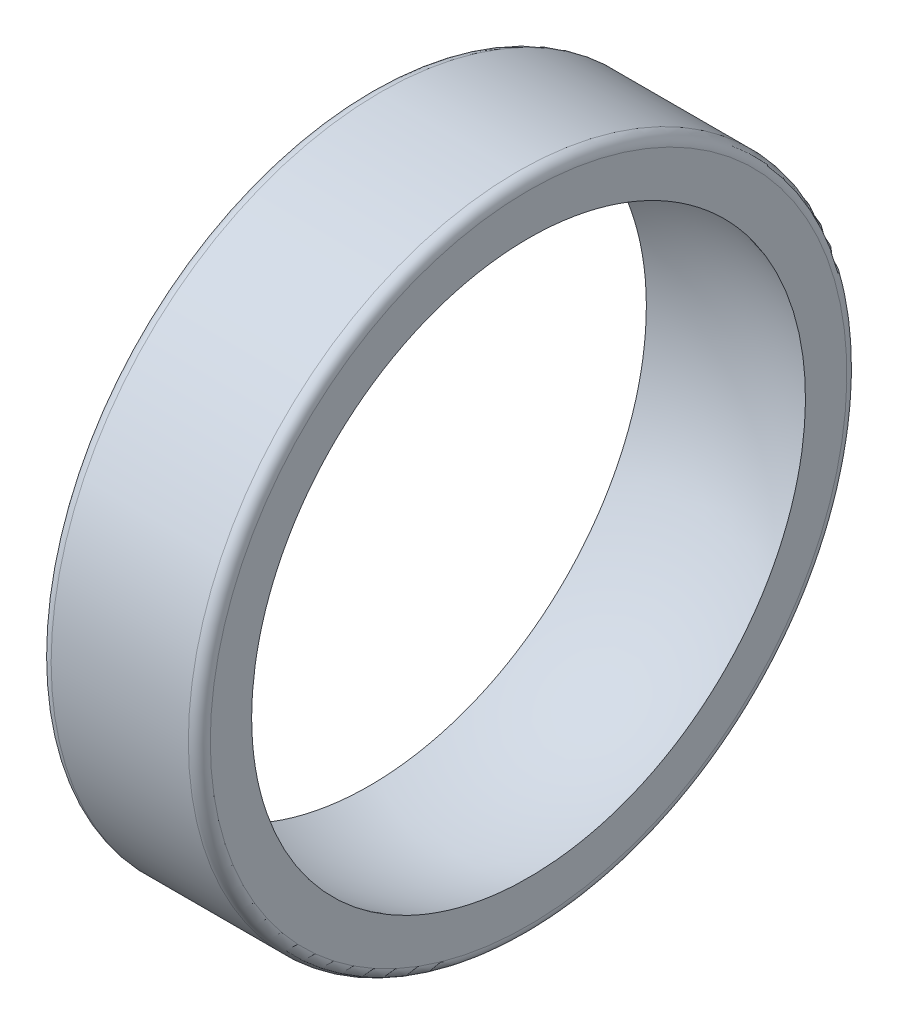
ISO-10303-21;
HEADER;
FILE_DESCRIPTION(('STEP AP214'),'2;1');
FILE_NAME('part.step','',(''),(''),'','','');
FILE_SCHEMA(('AUTOMOTIVE_DESIGN { 1 0 10303 214 1 1 1 1 }'));
ENDSEC;
DATA;
#1=APPLICATION_CONTEXT('core data for automotive mechanical design processes');
#2=APPLICATION_PROTOCOL_DEFINITION('international standard','automotive_design',2000,#1);
#3=PRODUCT_CONTEXT('',#1,'mechanical');
#4=PRODUCT('Part','Part','',(#3));
#5=PRODUCT_RELATED_PRODUCT_CATEGORY('part','',(#4));
#6=PRODUCT_DEFINITION_FORMATION('','',#4);
#7=PRODUCT_DEFINITION_CONTEXT('part definition',#1,'design');
#8=PRODUCT_DEFINITION('design','',#6,#7);
#9=PRODUCT_DEFINITION_SHAPE('','',#8);
#10=(LENGTH_UNIT() NAMED_UNIT(*) SI_UNIT(.MILLI.,.METRE.));
#11=(NAMED_UNIT(*) PLANE_ANGLE_UNIT() SI_UNIT($,.RADIAN.));
#12=(NAMED_UNIT(*) SI_UNIT($,.STERADIAN.) SOLID_ANGLE_UNIT());
#13=UNCERTAINTY_MEASURE_WITH_UNIT(LENGTH_MEASURE(1.E-05),#10,'distance_accuracy_value','');
#14=(GEOMETRIC_REPRESENTATION_CONTEXT(3) GLOBAL_UNCERTAINTY_ASSIGNED_CONTEXT((#13)) GLOBAL_UNIT_ASSIGNED_CONTEXT((#10,
#11,#12)) REPRESENTATION_CONTEXT('',''));
#15=CARTESIAN_POINT('',(0.,0.,0.));
#16=DIRECTION('',(0.,0.,1.));
#17=DIRECTION('',(1.,0.,0.));
#18=AXIS2_PLACEMENT_3D('',#15,#16,#17);
#19=CARTESIAN_POINT('',(20.75,0.,0.));
#20=DIRECTION('',(1.,0.,0.));
#21=DIRECTION('',(0.,0.,-1.));
#22=AXIS2_PLACEMENT_3D('',#19,#20,#21);
#23=CYLINDRICAL_SURFACE('',#22,60.);
#24=CARTESIAN_POINT('',(27.,0.,0.));
#25=DIRECTION('',(1.,0.,0.));
#26=DIRECTION('',(0.,1.,0.));
#27=AXIS2_PLACEMENT_3D('',#24,#25,#26);
#28=CIRCLE('',#27,60.);
#29=CARTESIAN_POINT('',(27.,60.,0.));
#30=VERTEX_POINT('',#29);
#31=EDGE_CURVE('E79',#30,#30,#28,.T.);
#32=ORIENTED_EDGE('',*,*,#31,.F.);
#33=EDGE_LOOP('',(#32));
#34=FACE_BOUND('',#33,.T.);
#35=CARTESIAN_POINT('',(1.99999999999999,0.,0.));
#36=DIRECTION('',(1.,0.,0.));
#37=DIRECTION('',(0.,1.,0.));
#38=AXIS2_PLACEMENT_3D('',#35,#36,#37);
#39=CIRCLE('',#38,60.);
#40=CARTESIAN_POINT('',(1.99999999999999,60.,0.));
#41=VERTEX_POINT('',#40);
#42=EDGE_CURVE('E99',#41,#41,#39,.F.);
#43=ORIENTED_EDGE('',*,*,#42,.F.);
#44=EDGE_LOOP('',(#43));
#45=FACE_BOUND('',#44,.T.);
#46=ADVANCED_FACE('F14',(#34,#45),#23,.T.);
#47=CARTESIAN_POINT('',(1.99999999999999,0.,0.));
#48=DIRECTION('',(1.,0.,0.));
#49=DIRECTION('',(0.,1.,0.));
#50=AXIS2_PLACEMENT_3D('',#47,#48,#49);
#51=TOROIDAL_SURFACE('',#50,58.,1.99999999999999);
#52=CARTESIAN_POINT('',(0.,0.,0.));
#53=DIRECTION('',(1.,0.,0.));
#54=DIRECTION('',(0.,0.,1.));
#55=AXIS2_PLACEMENT_3D('',#52,#53,#54);
#56=CIRCLE('',#55,58.);
#57=CARTESIAN_POINT('',(0.,0.,58.));
#58=VERTEX_POINT('',#57);
#59=EDGE_CURVE('E68',#58,#58,#56,.F.);
#60=ORIENTED_EDGE('',*,*,#59,.F.);
#61=EDGE_LOOP('',(#60));
#62=FACE_BOUND('',#61,.T.);
#63=ORIENTED_EDGE('',*,*,#42,.T.);
#64=EDGE_LOOP('',(#63));
#65=FACE_BOUND('',#64,.T.);
#66=ADVANCED_FACE('F84',(#62,#65),#51,.T.);
#67=CARTESIAN_POINT('',(27.,0.,0.));
#68=DIRECTION('',(1.,0.,0.));
#69=DIRECTION('',(0.,1.,0.));
#70=AXIS2_PLACEMENT_3D('',#67,#68,#69);
#71=TOROIDAL_SURFACE('',#70,58.,2.);
#72=ORIENTED_EDGE('',*,*,#31,.T.);
#73=EDGE_LOOP('',(#72));
#74=FACE_BOUND('',#73,.T.);
#75=CARTESIAN_POINT('',(29.,0.,0.));
#76=DIRECTION('',(-1.,0.,0.));
#77=DIRECTION('',(0.,0.,1.));
#78=AXIS2_PLACEMENT_3D('',#75,#76,#77);
#79=CIRCLE('',#78,58.);
#80=CARTESIAN_POINT('',(29.,0.,58.));
#81=VERTEX_POINT('',#80);
#82=EDGE_CURVE('E31',#81,#81,#79,.F.);
#83=ORIENTED_EDGE('',*,*,#82,.F.);
#84=EDGE_LOOP('',(#83));
#85=FACE_BOUND('',#84,.T.);
#86=ADVANCED_FACE('F81',(#74,#85),#71,.T.);
#87=CARTESIAN_POINT('',(0.,0.,54.2289516230857));
#88=DIRECTION('',(-1.,0.,0.));
#89=DIRECTION('',(0.,0.,1.));
#90=AXIS2_PLACEMENT_3D('',#87,#88,#89);
#91=PLANE('',#90);
#92=CARTESIAN_POINT('',(0.,50.4579032482839,0.));
#93=CARTESIAN_POINT('',(0.,50.4578942165374,-1.41747901961057));
#94=CARTESIAN_POINT('',(0.,50.3981229332466,-2.83520642923819));
#95=CARTESIAN_POINT('',(0.,50.1594119916498,-5.66080269766641));
#96=CARTESIAN_POINT('',(0.,49.9804437000898,-7.06866910554365));
#97=CARTESIAN_POINT('',(0.,49.5043497563438,-9.86578906018729));
#98=CARTESIAN_POINT('',(0.,49.2071042154521,-11.2550222383471));
#99=CARTESIAN_POINT('',(0.,48.4965922410418,-14.0033961521178));
#100=CARTESIAN_POINT('',(0.,48.0833328383131,-15.3625387059278));
#101=CARTESIAN_POINT('',(0.,47.1439232301512,-18.0406004114623));
#102=CARTESIAN_POINT('',(0.,46.6178200500792,-19.3595360579004));
#103=CARTESIAN_POINT('',(0.,45.4563538052293,-21.9484112370284));
#104=CARTESIAN_POINT('',(0.,44.8209891684876,-23.2183500644705));
#105=CARTESIAN_POINT('',(0.,43.4456835508566,-25.6998928313902));
#106=CARTESIAN_POINT('',(0.,42.7057669085628,-26.9115102597126));
#107=CARTESIAN_POINT('',(0.,41.126507961166,-29.2681096306182));
#108=CARTESIAN_POINT('',(0.,40.2871660100119,-30.4130918103977));
#109=CARTESIAN_POINT('',(0.,38.514934268562,-32.6283944709161));
#110=CARTESIAN_POINT('',(0.,37.582035423737,-33.6987077080903));
#111=CARTESIAN_POINT('',(0.,35.6293889290824,-35.7569424946668));
#112=CARTESIAN_POINT('',(0.,34.6096411992878,-36.7448639682064));
#113=CARTESIAN_POINT('',(0.,32.490509464534,-38.6313244585617));
#114=CARTESIAN_POINT('',(0.,31.3911226289657,-39.5298602956512));
#115=CARTESIAN_POINT('',(0.,29.1205612072635,-41.2311211258273));
#116=CARTESIAN_POINT('',(0.,27.9493866338154,-42.0338461358446));
#117=CARTESIAN_POINT('',(0.,25.543595944996,-43.5377660709861));
#118=CARTESIAN_POINT('',(0.,24.308980870128,-44.238962660583));
#119=CARTESIAN_POINT('',(0.,21.7850688941319,-45.5348563357488));
#120=CARTESIAN_POINT('',(0.,20.4957719921287,-46.1295534196131));
#121=CARTESIAN_POINT('',(0.,17.8716664638193,-47.2082185014144));
#122=CARTESIAN_POINT('',(0.,16.5368579733944,-47.6921868299147));
#123=CARTESIAN_POINT('',(0.,13.8312152807833,-48.5459559601719));
#124=CARTESIAN_POINT('',(0.,12.4603810786757,-48.915756762178));
#125=CARTESIAN_POINT('',(0.,9.69243047261454,-49.5385622960823));
#126=CARTESIAN_POINT('',(0.,8.29531402561589,-49.7915668366744));
#127=CARTESIAN_POINT('',(0.,5.4847337743968,-50.1789802433809));
#128=CARTESIAN_POINT('',(0.,4.07126997015219,-50.3133891093199));
#129=CARTESIAN_POINT('',(0.,1.23804430860456,-50.46265557761));
#130=CARTESIAN_POINT('',(0.,-0.181717546840363,-50.4775132152299));
#131=CARTESIAN_POINT('',(0.,-3.01744606725697,-50.3875716904323));
#132=CARTESIAN_POINT('',(0.,-4.43341273224713,-50.2827725285971));
#133=CARTESIAN_POINT('',(0.,-7.2514771381293,-49.9542632893576));
#134=CARTESIAN_POINT('',(0.,-8.65357494848953,-49.730553807875));
#135=CARTESIAN_POINT('',(0.,-11.4339408874757,-49.1658147219959));
#136=CARTESIAN_POINT('',(0.,-12.812209015914,-48.8247851166751));
#137=CARTESIAN_POINT('',(0.,-15.5351311022455,-48.0278261495076));
#138=CARTESIAN_POINT('',(0.,-16.8797847127707,-47.5718956008283));
#139=CARTESIAN_POINT('',(0.,-19.525903148654,-46.5483779442095));
#140=CARTESIAN_POINT('',(0.,-20.8273679754677,-45.9807908400328));
#141=CARTESIAN_POINT('',(0.,-23.3779043225308,-44.7379718384527));
#142=CARTESIAN_POINT('',(0.,-24.6269738644712,-44.0627358811224));
#143=CARTESIAN_POINT('',(0.,-27.0637871218787,-42.6094351399624));
#144=CARTESIAN_POINT('',(0.,-28.2515308136152,-41.8313703163425));
#145=CARTESIAN_POINT('',(0.,-30.557148511794,-40.1780147372503));
#146=CARTESIAN_POINT('',(0.,-31.6750284700528,-39.3027322816141));
#147=CARTESIAN_POINT('',(0.,-33.8330801921333,-37.461111423347));
#148=CARTESIAN_POINT('',(0.,-34.873252111183,-36.4947732026161));
#149=CARTESIAN_POINT('',(0.,-36.8682992865836,-34.4781075616025));
#150=CARTESIAN_POINT('',(0.,-37.8231912910662,-33.427796709843));
#151=CARTESIAN_POINT('',(0.,-39.6411301341785,-31.2504755845058));
#152=CARTESIAN_POINT('',(0.,-40.504176274235,-30.12346472766));
#153=CARTESIAN_POINT('',(0.,-42.1326778833888,-27.8001948274753));
#154=CARTESIAN_POINT('',(0.,-42.8980857588683,-26.6039024229225));
#155=CARTESIAN_POINT('',(0.,-44.3253537417507,-24.1511131178391));
#156=CARTESIAN_POINT('',(0.,-44.9872169846497,-22.8946180418469));
#157=CARTESIAN_POINT('',(0.,-46.203194930489,-20.3293195031164));
#158=CARTESIAN_POINT('',(0.,-46.757224399658,-19.020475640007));
#159=CARTESIAN_POINT('',(0.,-47.7530017955737,-16.3605524031181));
#160=CARTESIAN_POINT('',(0.,-48.1947355966583,-15.0094677398529));
#161=CARTESIAN_POINT('',(0.,-48.9619280195503,-12.277575386994));
#162=CARTESIAN_POINT('',(0.,-49.2876127354516,-10.8968311117518));
#163=CARTESIAN_POINT('',(0.,-49.8214786118022,-8.11337704658598));
#164=CARTESIAN_POINT('',(0.,-50.0297175937849,-6.710678415564));
#165=CARTESIAN_POINT('',(0.,-50.2716088963852,-4.42150390742653));
#166=CARTESIAN_POINT('',(0.,-50.3414474450798,-3.53869424586048));
#167=CARTESIAN_POINT('',(0.,-50.4345970777203,-1.77062314824071));
#168=CARTESIAN_POINT('',(0.,-50.457908135101,-0.885361710787427));
#169=CARTESIAN_POINT('',(0.,-50.457895429495,1.41655725989264));
#170=CARTESIAN_POINT('',(0.,-50.3982006034824,2.83337121173692));
#171=CARTESIAN_POINT('',(0.,-50.1597672620518,5.65751217315442));
#172=CARTESIAN_POINT('',(0.,-49.9809700725716,7.06483416130696));
#173=CARTESIAN_POINT('',(0.,-49.505083905605,9.86221730954923));
#174=CARTESIAN_POINT('',(0.,-49.207763323338,11.2522391468487));
#175=CARTESIAN_POINT('',(0.,-48.4969949197943,14.0020717230469));
#176=CARTESIAN_POINT('',(0.,-48.0835617038684,15.3618862384065));
#177=CARTESIAN_POINT('',(0.,-47.1438608249611,18.0407783350363));
#178=CARTESIAN_POINT('',(0.,-46.6176802746208,19.3598864724007));
#179=CARTESIAN_POINT('',(0.,-45.4560213532722,21.9491133871796));
#180=CARTESIAN_POINT('',(0.,-44.8205396527926,23.2192306708186));
#181=CARTESIAN_POINT('',(0.,-43.4451678257915,25.700753841664));
#182=CARTESIAN_POINT('',(0.,-42.7053321109896,26.9121898866823));
#183=CARTESIAN_POINT('',(0.,-41.1262672493638,29.2684379982115));
#184=CARTESIAN_POINT('',(0.,-40.2870389499133,30.4132506325974));
#185=CARTESIAN_POINT('',(0.,-38.5150587146721,32.6282389162216));
#186=CARTESIAN_POINT('',(0.,-37.5822974499439,33.6984071023693));
#187=CARTESIAN_POINT('',(0.,-35.6299450630653,35.7563806884838));
#188=CARTESIAN_POINT('',(0.,-34.610353458498,36.7441856307919));
#189=CARTESIAN_POINT('',(0.,-32.4912555485116,38.6307045497296));
#190=CARTESIAN_POINT('',(0.,-31.3917240390519,39.5293902152095));
#191=CARTESIAN_POINT('',(0.,-29.1208674157233,41.2309111480567));
#192=CARTESIAN_POINT('',(0.,-27.9495433629408,42.0337478315453));
#193=CARTESIAN_POINT('',(0.,-25.5429645839058,43.538161079723));
#194=CARTESIAN_POINT('',(0.,-24.3076858512723,44.2396992405294));
#195=CARTESIAN_POINT('',(0.,-21.7823074348564,45.5362024243109));
#196=CARTESIAN_POINT('',(0.,-20.4922044318999,46.1311609833328));
#197=CARTESIAN_POINT('',(0.,-17.8678206947252,47.2096579264686));
#198=CARTESIAN_POINT('',(0.,-16.5335865469565,47.6933097708183));
#199=CARTESIAN_POINT('',(0.,-13.8293235964871,48.5464620954812));
#200=CARTESIAN_POINT('',(0.,-12.4593034705564,48.9159899730315));
#201=CARTESIAN_POINT('',(0.,-10.1684773217205,49.4314549698082));
#202=CARTESIAN_POINT('',(0.,-9.25499738138924,49.6105953578021));
#203=CARTESIAN_POINT('',(0.,-7.41938975135202,49.9181181602853));
#204=CARTESIAN_POINT('',(0.,-6.49726124483452,50.0464957300545));
#205=CARTESIAN_POINT('',(0.,-4.64731470530067,50.2520507586378));
#206=CARTESIAN_POINT('',(0.,-3.71949666939763,50.3292281914724));
#207=CARTESIAN_POINT('',(0.,-1.86115460015058,50.4321549482291));
#208=CARTESIAN_POINT('',(0.,-0.930630833418868,50.4579091779741));
#209=CARTESIAN_POINT('',(0.,1.4174778632289,50.4578942165557));
#210=CARTESIAN_POINT('',(0.,2.83520411528718,50.3981230308188));
#211=CARTESIAN_POINT('',(0.,5.66079809432789,50.1594124785125));
#212=CARTESIAN_POINT('',(0.,7.0686633703809,49.9804444785966));
#213=CARTESIAN_POINT('',(0.,9.86578340398853,49.5043509169213));
#214=CARTESIAN_POINT('',(0.,11.2550177601177,49.2071052731638));
#215=CARTESIAN_POINT('',(0.,14.0033939591524,48.4965929079711));
#216=CARTESIAN_POINT('',(0.,15.3625376207724,48.083333219319));
#217=CARTESIAN_POINT('',(0.,18.040623728198,47.1439150507589));
#218=CARTESIAN_POINT('',(0.,19.3595820105579,46.6178017198665));
#219=CARTESIAN_POINT('',(0.,21.9485008290664,45.456311324859));
#220=CARTESIAN_POINT('',(0.,23.218460651228,44.8209326693067));
#221=CARTESIAN_POINT('',(0.,25.7000000333564,43.4456193492684));
#222=CARTESIAN_POINT('',(0.,26.9115950922672,42.7057126500735));
#223=CARTESIAN_POINT('',(0.,29.2681507988347,41.1264777809726));
#224=CARTESIAN_POINT('',(0.,30.413111744963,40.2871500564503));
#225=CARTESIAN_POINT('',(0.,32.628267419742,38.5150359149084));
#226=CARTESIAN_POINT('',(0.,33.6984621361451,37.5822494825793));
#227=CARTESIAN_POINT('',(0.,35.7564832850468,35.6298434897925));
#228=CARTESIAN_POINT('',(0.,36.7443093485327,34.610223540361));
#229=CARTESIAN_POINT('',(0.,38.6308186711735,32.4911183017334));
#230=CARTESIAN_POINT('',(0.,39.5294780787233,31.3916117788221));
#231=CARTESIAN_POINT('',(0.,41.2309513815751,29.1208087168605));
#232=CARTESIAN_POINT('',(0.,42.0337666728365,27.949513223785));
#233=CARTESIAN_POINT('',(0.,43.5381580490634,25.5429694311205));
#234=CARTESIAN_POINT('',(0.,44.2396935955702,24.3076957908087));
#235=CARTESIAN_POINT('',(0.,45.5361924115594,21.782327994012));
#236=CARTESIAN_POINT('',(0.,46.1311492189774,20.4922305193212));
#237=CARTESIAN_POINT('',(0.,47.2096479407752,17.8678475309178));
#238=CARTESIAN_POINT('',(0.,47.6933024217075,16.5336082368149));
#239=CARTESIAN_POINT('',(0.,48.5464591112811,13.8293346595793));
#240=CARTESIAN_POINT('',(0.,48.9159887168032,12.4593090531136));
#241=CARTESIAN_POINT('',(0.,49.4314551414631,10.1684765590919));
#242=CARTESIAN_POINT('',(0.,49.6105956586062,9.25499584764356));
#243=CARTESIAN_POINT('',(0.,49.9181186337141,7.41938666373317));
#244=CARTESIAN_POINT('',(0.,50.0464962470093,6.49725737446832));
#245=CARTESIAN_POINT('',(0.,50.2520511038529,4.64731081633889));
#246=CARTESIAN_POINT('',(0.,50.3292284072696,3.7194935541265));
#247=CARTESIAN_POINT('',(0.,50.4321549914263,1.86115303915012));
#248=CARTESIAN_POINT('',(0.,50.4579091779763,0.930630052997476));
#249=CARTESIAN_POINT('',(0.,50.4579032482839,0.));
#250=B_SPLINE_CURVE_WITH_KNOTS('',3,(#92,#93,#94,#95,#96,#97,#98,#99,#100,#101,#102,#103,#104,
#105,#106,#107,#108,#109,#110,#111,#112,#113,#114,#115,#116,#117,#118,#119,#120,#121,#122,#123,
#124,#125,#126,#127,#128,#129,#130,#131,#132,#133,#134,#135,#136,#137,#138,#139,#140,#141,#142,
#143,#144,#145,#146,#147,#148,#149,#150,#151,#152,#153,#154,#155,#156,#157,#158,#159,#160,#161,
#162,#163,#164,#165,#166,#167,#168,#169,#170,#171,#172,#173,#174,#175,#176,#177,#178,#179,#180,
#181,#182,#183,#184,#185,#186,#187,#188,#189,#190,#191,#192,#193,#194,#195,#196,#197,#198,#199,
#200,#201,#202,#203,#204,#205,#206,#207,#208,#209,#210,#211,#212,#213,#214,#215,#216,#217,#218,
#219,#220,#221,#222,#223,#224,#225,#226,#227,#228,#229,#230,#231,#232,#233,#234,#235,#236,#237,
#238,#239,#240,#241,#242,#243,#244,#245,#246,#247,#248,#249),.UNSPECIFIED.,.T.,.F.,(4,2,2,2,2,2,
2,2,2,2,2,2,2,2,2,2,2,2,2,2,2,2,2,2,2,2,2,2,2,2,2,2,2,2,2,2,2,2,2,2,2,2,2,2,2,2,2,2,2,2,2,2,2,2,
2,2,2,2,2,2,2,2,2,2,2,2,2,2,2,2,2,2,2,2,2,2,2,2,4),(0.,4.25160972579004,8.50424113284684,
12.761194136492,17.0178892116191,21.272813829759,25.5277996693658,29.7817966203531,
34.0357784277866,38.290172337854,42.5445701651394,46.7991192805549,51.0536676441447,
55.3081462501053,59.5626249241622,63.8170908969794,68.0715568605075,72.3260297926036,
76.580502730995,80.8349744142822,85.0894460768705,89.3438964182806,93.598346793203,
97.8528411149073,102.107335293233,106.361989965817,110.616646284758,114.870939646425,
119.125224509568,123.378672027478,127.632151894504,131.887697254607,136.143113725078,
140.401880214861,144.661182149721,148.912139879643,153.161002923536,155.816579967996,
158.472158528676,162.721019805949,166.971975772979,171.231279510685,175.49004772712,
179.745537255297,184.001156434812,188.254564818608,192.507936942501,196.761733718659,
201.015554129843,205.270721582059,209.525826158495,213.782539701025,218.039511321913,
222.292124196482,226.543715370041,229.335063275128,232.126677517623,234.918293176615,
237.70964250006,241.961248757277,246.213876699889,250.47083320649,254.727531711665,
258.982530417963,263.237591103096,267.491515543381,271.745420927768,275.999327008993,
280.253252146746,284.508312136337,288.763310143871,293.020006572467,297.276961005076,
301.52959102212,305.781199355485,308.572549603061,311.364166185041,314.155779502799,
316.947126485504),.UNSPECIFIED.);
#251=CARTESIAN_POINT('',(0.,50.4579032482839,0.));
#252=VERTEX_POINT('',#251);
#253=EDGE_CURVE('E26',#252,#252,#250,.T.);
#254=ORIENTED_EDGE('',*,*,#253,.F.);
#255=EDGE_LOOP('',(#254));
#256=FACE_BOUND('',#255,.T.);
#257=ORIENTED_EDGE('',*,*,#59,.T.);
#258=EDGE_LOOP('',(#257));
#259=FACE_BOUND('',#258,.T.);
#260=ADVANCED_FACE('F48',(#256,#259),#91,.T.);
#261=CARTESIAN_POINT('',(28.9999999999862,0.,54.2289516230377));
#262=DIRECTION('',(1.,0.,-3.66148092848931E-12));
#263=DIRECTION('',(-3.66148092848931E-12,0.,-1.));
#264=AXIS2_PLACEMENT_3D('',#261,#262,#263);
#265=PLANE('',#264);
#266=ORIENTED_EDGE('',*,*,#82,.T.);
#267=EDGE_LOOP('',(#266));
#268=FACE_BOUND('',#267,.T.);
#269=CARTESIAN_POINT('',(28.9999999999724,0.,50.4579032481877));
#270=CARTESIAN_POINT('',(28.9999999999724,-1.41747786322766,50.4578942164596));
#271=CARTESIAN_POINT('',(28.9999999999722,-2.83520411528473,50.3981230307227));
#272=CARTESIAN_POINT('',(28.9999999999713,-5.66079809432301,50.1594124784166));
#273=CARTESIAN_POINT('',(28.9999999999706,-7.06866337037482,49.9804444785009));
#274=CARTESIAN_POINT('',(28.9999999999689,-9.86578340398007,49.504350916826));
#275=CARTESIAN_POINT('',(28.9999999999678,-11.2550177601081,49.2071052730687));
#276=CARTESIAN_POINT('',(28.9999999999652,-14.0033939591404,48.4965929078767));
#277=CARTESIAN_POINT('',(28.9999999999637,-15.3625376207592,48.0833332192249));
#278=CARTESIAN_POINT('',(28.9999999999602,-18.0406237281826,47.1439150506656));
#279=CARTESIAN_POINT('',(28.9999999999583,-19.3595820105414,46.6178017197736));
#280=CARTESIAN_POINT('',(28.9999999999541,-21.9485008290477,45.4563113247672));
#281=CARTESIAN_POINT('',(28.9999999999517,-23.2184606512081,44.8209326692154));
#282=CARTESIAN_POINT('',(28.9999999999467,-25.7000000333345,43.4456193491783));
#283=CARTESIAN_POINT('',(28.999999999944,-26.9115950922442,42.705712649984));
#284=CARTESIAN_POINT('',(28.9999999999382,-29.2681507988097,41.1264777808845));
#285=CARTESIAN_POINT('',(28.9999999999351,-30.413111744937,40.2871500563629));
#286=CARTESIAN_POINT('',(28.9999999999286,-32.6282674197141,38.5150359148225));
#287=CARTESIAN_POINT('',(28.9999999999252,-33.6984621361164,37.5822494824942));
#288=CARTESIAN_POINT('',(28.9999999999181,-35.7564832850163,35.6298434897091));
#289=CARTESIAN_POINT('',(28.9999999999144,-36.7443093485013,34.6102235402785));
#290=CARTESIAN_POINT('',(28.9999999999066,-38.6308186711405,32.4911183016527));
#291=CARTESIAN_POINT('',(28.9999999999026,-39.5294780786896,31.3916117787423));
#292=CARTESIAN_POINT('',(28.9999999998943,-41.23095138154,29.1208087167826));
#293=CARTESIAN_POINT('',(28.99999999989,-42.0337666728006,27.9495132237081));
#294=CARTESIAN_POINT('',(28.9999999998812,-43.5381580490263,25.5429694310457));
#295=CARTESIAN_POINT('',(28.9999999998766,-44.2396935955325,24.3076957907349));
#296=CARTESIAN_POINT('',(28.9999999998674,-45.5361924115205,21.7823279939404));
#297=CARTESIAN_POINT('',(28.9999999998627,-46.131149218938,20.4922305192506));
#298=CARTESIAN_POINT('',(28.999999999853,-47.2096479407349,17.8678475308494));
#299=CARTESIAN_POINT('',(28.9999999998482,-47.6933024216668,16.5336082367477));
#300=CARTESIAN_POINT('',(28.9999999998383,-48.5464591112397,13.8293346595144));
#301=CARTESIAN_POINT('',(28.9999999998332,-48.9159887167614,12.4593090530499));
#302=CARTESIAN_POINT('',(28.9999999998249,-49.43145514142,10.1684765590345));
#303=CARTESIAN_POINT('',(28.9999999998215,-49.6105956585622,9.25499584759128));
#304=CARTESIAN_POINT('',(28.9999999998148,-49.9181186336689,7.41938666369126));
#305=CARTESIAN_POINT('',(28.9999999998114,-50.0464962469637,6.49725737443163));
#306=CARTESIAN_POINT('',(28.9999999998046,-50.2520511038072,4.64731081631269));
#307=CARTESIAN_POINT('',(28.9999999998012,-50.3292284072239,3.71949355410556));
#308=CARTESIAN_POINT('',(28.9999999997944,-50.4321549913816,1.86115303913967));
#309=CARTESIAN_POINT('',(28.999999999791,-50.4579091779323,0.930630052992268));
#310=CARTESIAN_POINT('',(28.9999999997825,-50.4578942164959,-1.41747901960934));
#311=CARTESIAN_POINT('',(28.9999999997773,-50.3981229332066,-2.83520642923581));
#312=CARTESIAN_POINT('',(28.9999999997669,-50.159411991613,-5.66080269766185));
#313=CARTESIAN_POINT('',(28.9999999997617,-49.9804437000546,-7.06866910553808));
#314=CARTESIAN_POINT('',(28.9999999997515,-49.5043497563119,-9.86578906017984));
#315=CARTESIAN_POINT('',(28.9999999997464,-49.207104215422,-11.2550222383388));
#316=CARTESIAN_POINT('',(28.9999999997364,-48.4965922410152,-14.0033961521079));
#317=CARTESIAN_POINT('',(28.9999999997314,-48.0833328382882,-15.3625387059172));
#318=CARTESIAN_POINT('',(28.9999999997216,-47.1439232301299,-18.0406004114504));
#319=CARTESIAN_POINT('',(28.9999999997167,-46.6178200500598,-19.3595360578879));
#320=CARTESIAN_POINT('',(28.9999999997073,-45.4563538052136,-21.9484112370149));
#321=CARTESIAN_POINT('',(28.9999999997026,-44.8209891684738,-23.2183500644566));
#322=CARTESIAN_POINT('',(28.9999999996935,-43.4456835508466,-25.6998928313757));
#323=CARTESIAN_POINT('',(28.9999999996891,-42.7057669085547,-26.9115102596979));
#324=CARTESIAN_POINT('',(28.9999999996805,-41.1265079611617,-29.268109630603));
#325=CARTESIAN_POINT('',(28.9999999996763,-40.2871660100095,-30.4130918103824));
#326=CARTESIAN_POINT('',(28.9999999996682,-38.5149342685635,-32.6283944709009));
#327=CARTESIAN_POINT('',(28.9999999996642,-37.5820354237404,-33.6987077080751));
#328=CARTESIAN_POINT('',(28.9999999996567,-35.6293889290896,-35.7569424946519));
#329=CARTESIAN_POINT('',(28.9999999996531,-34.6096411992969,-36.7448639681918));
#330=CARTESIAN_POINT('',(28.9999999996462,-32.4905094645469,-38.6313244585476));
#331=CARTESIAN_POINT('',(28.9999999996429,-31.3911226289805,-39.5298602956376));
#332=CARTESIAN_POINT('',(28.9999999996367,-29.1205612072821,-41.2311211258146));
#333=CARTESIAN_POINT('',(28.9999999996337,-27.9493866338358,-42.0338461358324));
#334=CARTESIAN_POINT('',(28.9999999996282,-25.5435959450201,-43.5377660709752));
#335=CARTESIAN_POINT('',(28.9999999996256,-24.3089808701538,-44.2389626605728));
#336=CARTESIAN_POINT('',(28.9999999996209,-21.7850688941613,-45.5348563357401));
#337=CARTESIAN_POINT('',(28.9999999996187,-20.4957719921598,-46.1295534196053));
#338=CARTESIAN_POINT('',(28.9999999996148,-17.8716664638538,-47.2082185014085));
#339=CARTESIAN_POINT('',(28.999999999613,-16.5368579734305,-47.6921868299098));
#340=CARTESIAN_POINT('',(28.9999999996099,-13.8312152808226,-48.545955960169));
#341=CARTESIAN_POINT('',(28.9999999996085,-12.4603810787166,-48.9157567621762));
#342=CARTESIAN_POINT('',(28.9999999996063,-9.6924304726584,-49.538562296083));
#343=CARTESIAN_POINT('',(28.9999999996053,-8.29531402566119,-49.7915668366763));
#344=CARTESIAN_POINT('',(28.9999999996039,-5.48473377444491,-50.1789802433855));
#345=CARTESIAN_POINT('',(28.9999999996034,-4.07126997020165,-50.3133891093258));
#346=CARTESIAN_POINT('',(28.9999999996029,-1.23804430865659,-50.4626555776188));
#347=CARTESIAN_POINT('',(28.9999999996028,0.181717546787107,-50.4775132152401));
#348=CARTESIAN_POINT('',(28.9999999996031,3.01744606720139,-50.3875716904456));
#349=CARTESIAN_POINT('',(28.9999999996035,4.43341273219045,-50.2827725286119));
#350=CARTESIAN_POINT('',(28.9999999996047,7.25147713807057,-49.9542632893757));
#351=CARTESIAN_POINT('',(28.9999999996055,8.65357494842983,-49.7305538078948));
#352=CARTESIAN_POINT('',(28.9999999996076,11.4339408874142,-49.1658147220191));
#353=CARTESIAN_POINT('',(28.9999999996089,12.8122090158517,-48.8247851167));
#354=CARTESIAN_POINT('',(28.9999999996118,15.5351311021817,-48.027826149536));
#355=CARTESIAN_POINT('',(28.9999999996134,16.8797847127062,-47.5718956008586));
#356=CARTESIAN_POINT('',(28.9999999996172,19.5259031485884,-46.5483779442434));
#357=CARTESIAN_POINT('',(28.9999999996193,20.8273679754015,-45.9807908400686));
#358=CARTESIAN_POINT('',(28.9999999996238,23.3779043224638,-44.7379718384922));
#359=CARTESIAN_POINT('',(28.9999999996263,24.6269738644039,-44.0627358811639));
#360=CARTESIAN_POINT('',(28.9999999996316,27.0637871218107,-42.6094351400076));
#361=CARTESIAN_POINT('',(28.9999999996345,28.2515308135471,-41.8313703163897));
#362=CARTESIAN_POINT('',(28.9999999996405,30.5571485117256,-40.1780147373013));
#363=CARTESIAN_POINT('',(28.9999999996437,31.6750284699845,-39.302732281667));
#364=CARTESIAN_POINT('',(28.9999999996505,33.833080192065,-37.4611114234038));
#365=CARTESIAN_POINT('',(28.999999999654,34.8732521111149,-36.4947732026748));
#366=CARTESIAN_POINT('',(28.9999999996614,36.8682992865158,-34.478107561665));
#367=CARTESIAN_POINT('',(28.9999999996652,37.8231912909987,-33.4277967099074));
#368=CARTESIAN_POINT('',(28.9999999996732,39.6411301341118,-31.250475584574));
#369=CARTESIAN_POINT('',(28.9999999996773,40.5041762741688,-30.12346472773));
#370=CARTESIAN_POINT('',(28.9999999996858,42.1326778833236,-27.8001948275491));
#371=CARTESIAN_POINT('',(28.9999999996902,42.8980857588037,-26.603902422998));
#372=CARTESIAN_POINT('',(28.9999999996992,44.3253537416875,-24.1511131179183));
#373=CARTESIAN_POINT('',(28.9999999997038,44.9872169845873,-22.8946180419279));
#374=CARTESIAN_POINT('',(28.9999999997132,46.2031949304282,-20.3293195032009));
#375=CARTESIAN_POINT('',(28.999999999718,46.7572243995981,-19.0204756400932));
#376=CARTESIAN_POINT('',(28.9999999997277,47.7530017955157,-16.3605524032076));
#377=CARTESIAN_POINT('',(28.9999999997327,48.1947355966014,-15.009467739944));
#378=CARTESIAN_POINT('',(28.9999999997427,48.9619280194956,-12.2775753870882));
#379=CARTESIAN_POINT('',(28.9999999997477,49.2876127353981,-10.8968311118475));
#380=CARTESIAN_POINT('',(28.9999999997579,49.8214786117512,-8.11337704668464));
#381=CARTESIAN_POINT('',(28.9999999997631,50.0297175937352,-6.71067841566406));
#382=CARTESIAN_POINT('',(28.9999999997714,50.2716088963395,-4.42150390751118));
#383=CARTESIAN_POINT('',(28.9999999997747,50.341447445036,-3.53869424592825));
#384=CARTESIAN_POINT('',(28.9999999997811,50.4345970776782,-1.77062314827464));
#385=CARTESIAN_POINT('',(28.9999999997844,50.4579081350589,-0.88536171080439));
#386=CARTESIAN_POINT('',(28.9999999997928,50.4578954294505,1.41655725989143));
#387=CARTESIAN_POINT('',(28.999999999798,50.3982006034365,2.83337121173445));
#388=CARTESIAN_POINT('',(28.9999999998083,50.1597672620031,5.65751217314932));
#389=CARTESIAN_POINT('',(28.9999999998135,49.9809700725215,7.06483416130048));
#390=CARTESIAN_POINT('',(28.9999999998237,49.5050839055524,9.86221730953986));
#391=CARTESIAN_POINT('',(28.9999999998288,49.2077633232842,11.2522391468378));
#392=CARTESIAN_POINT('',(28.9999999998389,48.4969949197382,14.0020717230329));
#393=CARTESIAN_POINT('',(28.9999999998439,48.0835617038112,15.3618862383909));
#394=CARTESIAN_POINT('',(28.9999999998537,47.1438608249019,18.0407783350174));
#395=CARTESIAN_POINT('',(28.9999999998585,46.6176802745607,19.3598864723801));
#396=CARTESIAN_POINT('',(28.999999999868,45.4560213532104,21.9491133871557));
#397=CARTESIAN_POINT('',(28.9999999998726,44.82053965273,23.2192306707929));
#398=CARTESIAN_POINT('',(28.9999999998817,43.4451678257275,25.7007538416347));
#399=CARTESIAN_POINT('',(28.9999999998862,42.7053321109249,26.9121898866512));
#400=CARTESIAN_POINT('',(28.9999999998948,41.126267249298,29.2684379981767));
#401=CARTESIAN_POINT('',(28.999999999899,40.2870389498469,30.4132506325608));
#402=CARTESIAN_POINT('',(28.9999999999071,38.5150587146049,32.6282389161812));
#403=CARTESIAN_POINT('',(28.999999999911,37.5822974498764,33.698407102327));
#404=CARTESIAN_POINT('',(28.9999999999186,35.6299450629973,35.7563806884377));
#405=CARTESIAN_POINT('',(28.9999999999222,34.6103534584299,36.7441856307439));
#406=CARTESIAN_POINT('',(28.9999999999291,32.4912555484432,38.6307045496778));
#407=CARTESIAN_POINT('',(28.9999999999324,31.3917240389836,39.5293902151558));
#408=CARTESIAN_POINT('',(28.9999999999386,29.1208674156552,41.2309111479991));
#409=CARTESIAN_POINT('',(28.9999999999415,27.9495433628727,42.0337478314857));
#410=CARTESIAN_POINT('',(28.999999999947,25.5429645838382,43.5381610796596));
#411=CARTESIAN_POINT('',(28.9999999999496,24.3076858512051,44.2396992404641));
#412=CARTESIAN_POINT('',(28.9999999999544,21.78230743479,45.5362024242419));
#413=CARTESIAN_POINT('',(28.9999999999565,20.492204431834,46.1311609832619));
#414=CARTESIAN_POINT('',(28.9999999999605,17.8678206946603,47.209657926394));
#415=CARTESIAN_POINT('',(28.9999999999623,16.5335865468923,47.693309770742));
#416=CARTESIAN_POINT('',(28.9999999999654,13.8293235964243,48.5464620954012));
#417=CARTESIAN_POINT('',(28.9999999999667,12.4593034704944,48.9159899729497));
#418=CARTESIAN_POINT('',(28.9999999999686,10.1684773216642,49.4314549697226));
#419=CARTESIAN_POINT('',(28.9999999999693,9.25499738133791,49.6105953577147));
#420=CARTESIAN_POINT('',(28.9999999999704,7.41938975131073,49.9181181601948));
#421=CARTESIAN_POINT('',(28.9999999999709,6.49726124479831,50.0464957299626));
#422=CARTESIAN_POINT('',(28.9999999999716,4.64731470527472,50.2520507585438));
#423=CARTESIAN_POINT('',(28.9999999999719,3.71949666937685,50.3292281913776));
#424=CARTESIAN_POINT('',(28.9999999999723,1.86115460014018,50.4321549481332));
#425=CARTESIAN_POINT('',(28.9999999999724,0.930630833413671,50.457909177878));
#426=CARTESIAN_POINT('',(28.9999999999724,0.,50.4579032481877));
#427=B_SPLINE_CURVE_WITH_KNOTS('',3,(#269,#270,#271,#272,#273,#274,#275,#276,#277,#278,#279,
#280,#281,#282,#283,#284,#285,#286,#287,#288,#289,#290,#291,#292,#293,#294,#295,#296,#297,#298,
#299,#300,#301,#302,#303,#304,#305,#306,#307,#308,#309,#310,#311,#312,#313,#314,#315,#316,#317,
#318,#319,#320,#321,#322,#323,#324,#325,#326,#327,#328,#329,#330,#331,#332,#333,#334,#335,#336,
#337,#338,#339,#340,#341,#342,#343,#344,#345,#346,#347,#348,#349,#350,#351,#352,#353,#354,#355,
#356,#357,#358,#359,#360,#361,#362,#363,#364,#365,#366,#367,#368,#369,#370,#371,#372,#373,#374,
#375,#376,#377,#378,#379,#380,#381,#382,#383,#384,#385,#386,#387,#388,#389,#390,#391,#392,#393,
#394,#395,#396,#397,#398,#399,#400,#401,#402,#403,#404,#405,#406,#407,#408,#409,#410,#411,#412,
#413,#414,#415,#416,#417,#418,#419,#420,#421,#422,#423,#424,#425,#426),.UNSPECIFIED.,.T.,.F.,(4,
2,2,2,2,2,2,2,2,2,2,2,2,2,2,2,2,2,2,2,2,2,2,2,2,2,2,2,2,2,2,2,2,2,2,2,2,2,2,2,2,2,2,2,2,2,2,2,2,
2,2,2,2,2,2,2,2,2,2,2,2,2,2,2,2,2,2,2,2,2,2,2,2,2,2,2,2,2,4),(0.,4.2516062572133,
8.50423419982132,12.7611907064194,17.0178892115909,21.2728879178847,25.5279486030144,
29.781873043296,34.035778427679,38.2896845089002,42.5436096466493,46.7986696362375,
51.0536676437678,55.3103640723601,59.5673185049655,63.819948522006,68.0715568553669,
70.8629071029278,73.6545236848922,76.4461370026345,79.2374839853231,83.4890937111095,
87.7417251181627,91.9986781218042,96.2553731969277,100.510297815064,104.765283654667,
109.019280605651,113.273262413081,117.527656323145,121.782054150426,126.036603265838,
130.291151629424,134.545630235381,138.800108909434,143.054574882248,147.309040845773,
151.563513777865,155.817986716253,160.072458399536,164.326930062121,168.581380403528,
172.835830778446,177.090325100147,181.344819278469,185.59947395105,189.854130269987,
194.10842363165,198.362708494789,202.616156012696,206.869635879718,211.125181239818,
215.380597710285,219.639364200065,223.89866613492,228.149623864839,232.398486908728,
235.05406395324,237.70964251397,241.95850379124,246.209459758266,250.468763495968,
254.7275317124,258.983021240573,263.238640420085,267.492048803877,271.745420927767,
275.999217703921,280.253038115101,284.508205567313,288.763310143746,293.020023686272,
297.276995307156,301.529608181721,305.781199355277,308.572547260349,311.364161502828,
314.155777161804,316.947126485234),.UNSPECIFIED.);
#428=CARTESIAN_POINT('',(28.9999999999724,0.,50.4579032481877));
#429=VERTEX_POINT('',#428);
#430=EDGE_CURVE('E10',#429,#429,#427,.T.);
#431=ORIENTED_EDGE('',*,*,#430,.F.);
#432=EDGE_LOOP('',(#431));
#433=FACE_BOUND('',#432,.T.);
#434=ADVANCED_FACE('F45',(#268,#433),#265,.T.);
#435=CARTESIAN_POINT('',(14.499999999819,0.,0.));
#436=DIRECTION('',(0.622272349241435,0.684317625692714,0.380113812608582));
#437=DIRECTION('',(-0.591882040803892,0.093524084113019,0.800580349162181));
#438=AXIS2_PLACEMENT_3D('',#435,#436,#437);
#439=SPHERICAL_SURFACE('',#438,52.5000000019802);
#440=ORIENTED_EDGE('',*,*,#253,.T.);
#441=EDGE_LOOP('',(#440));
#442=FACE_BOUND('',#441,.T.);
#443=ORIENTED_EDGE('',*,*,#430,.T.);
#444=EDGE_LOOP('',(#443));
#445=FACE_BOUND('',#444,.T.);
#446=ADVANCED_FACE('F42',(#442,#445),#439,.F.);
#447=CLOSED_SHELL('',(#46,#66,#86,#260,#434,#446));
#448=MANIFOLD_SOLID_BREP('B1',#447);
#449=ADVANCED_BREP_SHAPE_REPRESENTATION('',(#18,#448),#14);
#450=SHAPE_DEFINITION_REPRESENTATION(#9,#449);
ENDSEC;
END-ISO-10303-21;
